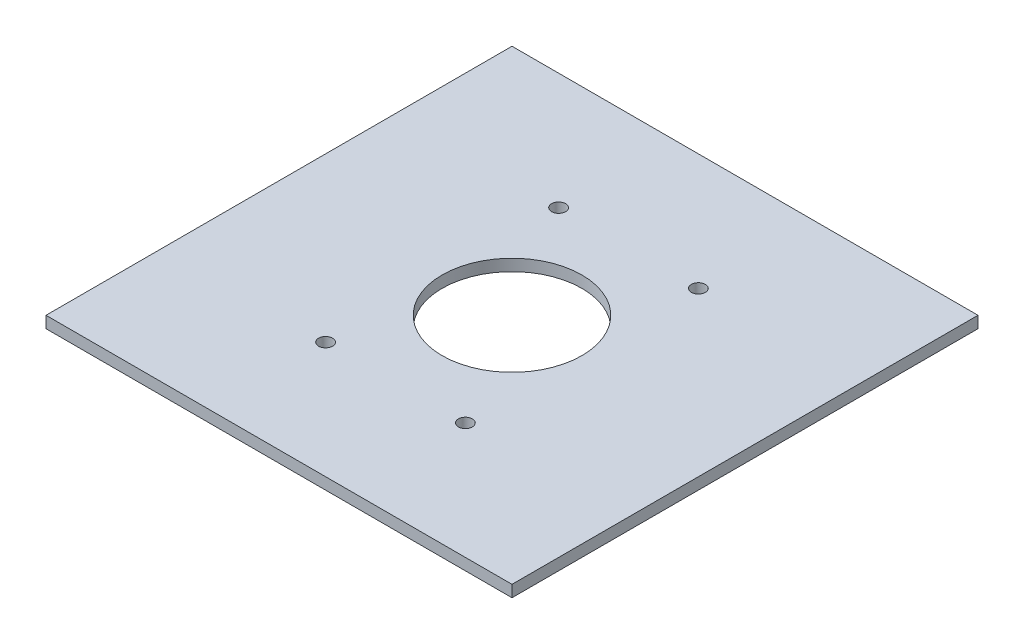
ISO-10303-21;
HEADER;
FILE_DESCRIPTION(('STEP AP214'),'2;1');
FILE_NAME('part.step','',(''),(''),'','','');
FILE_SCHEMA(('AUTOMOTIVE_DESIGN { 1 0 10303 214 1 1 1 1 }'));
ENDSEC;
DATA;
#1=APPLICATION_CONTEXT('core data for automotive mechanical design processes');
#2=APPLICATION_PROTOCOL_DEFINITION('international standard','automotive_design',2000,#1);
#3=PRODUCT_CONTEXT('',#1,'mechanical');
#4=PRODUCT('Part','Part','',(#3));
#5=PRODUCT_RELATED_PRODUCT_CATEGORY('part','',(#4));
#6=PRODUCT_DEFINITION_FORMATION('','',#4);
#7=PRODUCT_DEFINITION_CONTEXT('part definition',#1,'design');
#8=PRODUCT_DEFINITION('design','',#6,#7);
#9=PRODUCT_DEFINITION_SHAPE('','',#8);
#10=(LENGTH_UNIT() NAMED_UNIT(*) SI_UNIT(.MILLI.,.METRE.));
#11=(NAMED_UNIT(*) PLANE_ANGLE_UNIT() SI_UNIT($,.RADIAN.));
#12=(NAMED_UNIT(*) SI_UNIT($,.STERADIAN.) SOLID_ANGLE_UNIT());
#13=UNCERTAINTY_MEASURE_WITH_UNIT(LENGTH_MEASURE(1.E-05),#10,'distance_accuracy_value','');
#14=(GEOMETRIC_REPRESENTATION_CONTEXT(3) GLOBAL_UNCERTAINTY_ASSIGNED_CONTEXT((#13)) GLOBAL_UNIT_ASSIGNED_CONTEXT((#10,
#11,#12)) REPRESENTATION_CONTEXT('',''));
#15=CARTESIAN_POINT('',(0.,0.,0.));
#16=DIRECTION('',(0.,0.,1.));
#17=DIRECTION('',(1.,0.,0.));
#18=AXIS2_PLACEMENT_3D('',#15,#16,#17);
#19=CARTESIAN_POINT('',(63.5,3.175,63.5));
#20=DIRECTION('',(-1.,0.,0.));
#21=DIRECTION('',(0.,0.,1.));
#22=AXIS2_PLACEMENT_3D('',#19,#20,#21);
#23=PLANE('',#22);
#24=DIRECTION('',(0.,0.,-1.));
#25=VECTOR('',#24,1.);
#26=CARTESIAN_POINT('',(63.5,0.,63.5));
#27=LINE('',#26,#25);
#28=CARTESIAN_POINT('',(63.5,0.,63.5));
#29=VERTEX_POINT('',#28);
#30=CARTESIAN_POINT('',(63.5,0.,-63.5));
#31=VERTEX_POINT('',#30);
#32=EDGE_CURVE('E98',#29,#31,#27,.T.);
#33=ORIENTED_EDGE('',*,*,#32,.T.);
#34=DIRECTION('',(0.,-1.,0.));
#35=VECTOR('',#34,1.);
#36=CARTESIAN_POINT('',(63.5,3.175,-63.5));
#37=LINE('',#36,#35);
#38=CARTESIAN_POINT('',(63.5,3.175,-63.5));
#39=VERTEX_POINT('',#38);
#40=EDGE_CURVE('E11',#39,#31,#37,.T.);
#41=ORIENTED_EDGE('',*,*,#40,.F.);
#42=DIRECTION('',(0.,0.,-1.));
#43=VECTOR('',#42,1.);
#44=CARTESIAN_POINT('',(63.5,3.175,63.5));
#45=LINE('',#44,#43);
#46=CARTESIAN_POINT('',(63.5,3.175,63.5));
#47=VERTEX_POINT('',#46);
#48=EDGE_CURVE('E86',#47,#39,#45,.T.);
#49=ORIENTED_EDGE('',*,*,#48,.F.);
#50=DIRECTION('',(0.,-1.,0.));
#51=VECTOR('',#50,1.);
#52=CARTESIAN_POINT('',(63.5,3.175,63.5));
#53=LINE('',#52,#51);
#54=EDGE_CURVE('E94',#47,#29,#53,.T.);
#55=ORIENTED_EDGE('',*,*,#54,.T.);
#56=EDGE_LOOP('',(#33,#41,#49,#55));
#57=FACE_BOUND('',#56,.T.);
#58=ADVANCED_FACE('F35',(#57),#23,.F.);
#59=CARTESIAN_POINT('',(-63.5,3.175,-63.5));
#60=DIRECTION('',(0.,0.,1.));
#61=DIRECTION('',(1.,0.,0.));
#62=AXIS2_PLACEMENT_3D('',#59,#60,#61);
#63=PLANE('',#62);
#64=DIRECTION('',(-1.,0.,0.));
#65=VECTOR('',#64,1.);
#66=CARTESIAN_POINT('',(-63.5,0.,-63.5));
#67=LINE('',#66,#65);
#68=CARTESIAN_POINT('',(-63.5,0.,-63.5));
#69=VERTEX_POINT('',#68);
#70=EDGE_CURVE('E90',#31,#69,#67,.T.);
#71=ORIENTED_EDGE('',*,*,#70,.T.);
#72=DIRECTION('',(0.,-1.,0.));
#73=VECTOR('',#72,1.);
#74=CARTESIAN_POINT('',(-63.5,3.175,-63.5));
#75=LINE('',#74,#73);
#76=CARTESIAN_POINT('',(-63.5,3.175,-63.5));
#77=VERTEX_POINT('',#76);
#78=EDGE_CURVE('E43',#77,#69,#75,.T.);
#79=ORIENTED_EDGE('',*,*,#78,.F.);
#80=DIRECTION('',(-1.,0.,0.));
#81=VECTOR('',#80,1.);
#82=CARTESIAN_POINT('',(-63.5,3.175,-63.5));
#83=LINE('',#82,#81);
#84=EDGE_CURVE('E81',#39,#77,#83,.T.);
#85=ORIENTED_EDGE('',*,*,#84,.F.);
#86=ORIENTED_EDGE('',*,*,#40,.T.);
#87=EDGE_LOOP('',(#71,#79,#85,#86));
#88=FACE_BOUND('',#87,.T.);
#89=ADVANCED_FACE('F89',(#88),#63,.F.);
#90=CARTESIAN_POINT('',(-63.5,3.175,63.5));
#91=DIRECTION('',(1.,0.,0.));
#92=DIRECTION('',(0.,0.,-1.));
#93=AXIS2_PLACEMENT_3D('',#90,#91,#92);
#94=PLANE('',#93);
#95=DIRECTION('',(0.,0.,1.));
#96=VECTOR('',#95,1.);
#97=CARTESIAN_POINT('',(-63.5,0.,63.5));
#98=LINE('',#97,#96);
#99=CARTESIAN_POINT('',(-63.5,0.,63.5));
#100=VERTEX_POINT('',#99);
#101=EDGE_CURVE('E68',#69,#100,#98,.T.);
#102=ORIENTED_EDGE('',*,*,#101,.T.);
#103=DIRECTION('',(0.,-1.,0.));
#104=VECTOR('',#103,1.);
#105=CARTESIAN_POINT('',(-63.5,3.175,63.5));
#106=LINE('',#105,#104);
#107=CARTESIAN_POINT('',(-63.5,3.175,63.5));
#108=VERTEX_POINT('',#107);
#109=EDGE_CURVE('E91',#108,#100,#106,.T.);
#110=ORIENTED_EDGE('',*,*,#109,.F.);
#111=DIRECTION('',(0.,0.,1.));
#112=VECTOR('',#111,1.);
#113=CARTESIAN_POINT('',(-63.5,3.175,63.5));
#114=LINE('',#113,#112);
#115=EDGE_CURVE('E84',#77,#108,#114,.T.);
#116=ORIENTED_EDGE('',*,*,#115,.F.);
#117=ORIENTED_EDGE('',*,*,#78,.T.);
#118=EDGE_LOOP('',(#102,#110,#116,#117));
#119=FACE_BOUND('',#118,.T.);
#120=ADVANCED_FACE('F92',(#119),#94,.F.);
#121=CARTESIAN_POINT('',(-63.5,3.175,63.5));
#122=DIRECTION('',(0.,0.,-1.));
#123=DIRECTION('',(-1.,0.,0.));
#124=AXIS2_PLACEMENT_3D('',#121,#122,#123);
#125=PLANE('',#124);
#126=DIRECTION('',(1.,0.,0.));
#127=VECTOR('',#126,1.);
#128=CARTESIAN_POINT('',(-63.5,0.,63.5));
#129=LINE('',#128,#127);
#130=EDGE_CURVE('E74',#100,#29,#129,.T.);
#131=ORIENTED_EDGE('',*,*,#130,.T.);
#132=ORIENTED_EDGE('',*,*,#54,.F.);
#133=DIRECTION('',(1.,0.,0.));
#134=VECTOR('',#133,1.);
#135=CARTESIAN_POINT('',(-63.5,3.175,63.5));
#136=LINE('',#135,#134);
#137=EDGE_CURVE('E51',#108,#47,#136,.T.);
#138=ORIENTED_EDGE('',*,*,#137,.F.);
#139=ORIENTED_EDGE('',*,*,#109,.T.);
#140=EDGE_LOOP('',(#131,#132,#138,#139));
#141=FACE_BOUND('',#140,.T.);
#142=ADVANCED_FACE('F106',(#141),#125,.F.);
#143=CARTESIAN_POINT('',(0.,3.175,0.));
#144=DIRECTION('',(0.,-1.,0.));
#145=DIRECTION('',(0.,0.,-1.));
#146=AXIS2_PLACEMENT_3D('',#143,#144,#145);
#147=PLANE('',#146);
#148=CARTESIAN_POINT('',(19.05,3.175,31.75));
#149=DIRECTION('',(0.,1.,0.));
#150=DIRECTION('',(0.,0.,1.));
#151=AXIS2_PLACEMENT_3D('',#148,#149,#150);
#152=CIRCLE('',#151,1.905);
#153=CARTESIAN_POINT('',(19.05,3.175,33.655));
#154=VERTEX_POINT('',#153);
#155=EDGE_CURVE('E121',#154,#154,#152,.T.);
#156=ORIENTED_EDGE('',*,*,#155,.F.);
#157=EDGE_LOOP('',(#156));
#158=FACE_BOUND('',#157,.T.);
#159=CARTESIAN_POINT('',(-19.05,3.175,31.75));
#160=DIRECTION('',(0.,1.,0.));
#161=DIRECTION('',(0.,0.,1.));
#162=AXIS2_PLACEMENT_3D('',#159,#160,#161);
#163=CIRCLE('',#162,1.905);
#164=CARTESIAN_POINT('',(-19.05,3.175,33.655));
#165=VERTEX_POINT('',#164);
#166=EDGE_CURVE('E127',#165,#165,#163,.T.);
#167=ORIENTED_EDGE('',*,*,#166,.F.);
#168=EDGE_LOOP('',(#167));
#169=FACE_BOUND('',#168,.T.);
#170=CARTESIAN_POINT('',(19.05,3.175,-31.75));
#171=DIRECTION('',(0.,1.,0.));
#172=DIRECTION('',(0.,0.,1.));
#173=AXIS2_PLACEMENT_3D('',#170,#171,#172);
#174=CIRCLE('',#173,1.905);
#175=CARTESIAN_POINT('',(19.05,3.175,-29.845));
#176=VERTEX_POINT('',#175);
#177=EDGE_CURVE('E133',#176,#176,#174,.T.);
#178=ORIENTED_EDGE('',*,*,#177,.F.);
#179=EDGE_LOOP('',(#178));
#180=FACE_BOUND('',#179,.T.);
#181=CARTESIAN_POINT('',(-19.05,3.175,-31.75));
#182=DIRECTION('',(0.,1.,0.));
#183=DIRECTION('',(0.,0.,1.));
#184=AXIS2_PLACEMENT_3D('',#181,#182,#183);
#185=CIRCLE('',#184,1.905);
#186=CARTESIAN_POINT('',(-19.05,3.175,-29.845));
#187=VERTEX_POINT('',#186);
#188=EDGE_CURVE('E115',#187,#187,#185,.T.);
#189=ORIENTED_EDGE('',*,*,#188,.F.);
#190=EDGE_LOOP('',(#189));
#191=FACE_BOUND('',#190,.T.);
#192=CARTESIAN_POINT('',(0.,3.175,0.));
#193=DIRECTION('',(0.,1.,0.));
#194=DIRECTION('',(0.,0.,1.));
#195=AXIS2_PLACEMENT_3D('',#192,#193,#194);
#196=CIRCLE('',#195,19.05);
#197=CARTESIAN_POINT('',(0.,3.175,19.05));
#198=VERTEX_POINT('',#197);
#199=EDGE_CURVE('E101',#198,#198,#196,.T.);
#200=ORIENTED_EDGE('',*,*,#199,.F.);
#201=EDGE_LOOP('',(#200));
#202=FACE_BOUND('',#201,.T.);
#203=ORIENTED_EDGE('',*,*,#48,.T.);
#204=ORIENTED_EDGE('',*,*,#84,.T.);
#205=ORIENTED_EDGE('',*,*,#115,.T.);
#206=ORIENTED_EDGE('',*,*,#137,.T.);
#207=EDGE_LOOP('',(#203,#204,#205,#206));
#208=FACE_BOUND('',#207,.T.);
#209=ADVANCED_FACE('F82',(#158,#169,#180,#191,#202,#208),#147,.F.);
#210=CARTESIAN_POINT('',(0.,0.,0.));
#211=DIRECTION('',(0.,-1.,0.));
#212=DIRECTION('',(0.,0.,-1.));
#213=AXIS2_PLACEMENT_3D('',#210,#211,#212);
#214=PLANE('',#213);
#215=CARTESIAN_POINT('',(19.05,0.,31.75));
#216=DIRECTION('',(0.,1.,0.));
#217=DIRECTION('',(0.,0.,1.));
#218=AXIS2_PLACEMENT_3D('',#215,#216,#217);
#219=CIRCLE('',#218,1.905);
#220=CARTESIAN_POINT('',(19.05,0.,33.655));
#221=VERTEX_POINT('',#220);
#222=EDGE_CURVE('E118',#221,#221,#219,.T.);
#223=ORIENTED_EDGE('',*,*,#222,.T.);
#224=EDGE_LOOP('',(#223));
#225=FACE_BOUND('',#224,.T.);
#226=CARTESIAN_POINT('',(-19.05,0.,31.75));
#227=DIRECTION('',(0.,1.,0.));
#228=DIRECTION('',(0.,0.,1.));
#229=AXIS2_PLACEMENT_3D('',#226,#227,#228);
#230=CIRCLE('',#229,1.905);
#231=CARTESIAN_POINT('',(-19.05,0.,33.655));
#232=VERTEX_POINT('',#231);
#233=EDGE_CURVE('E124',#232,#232,#230,.T.);
#234=ORIENTED_EDGE('',*,*,#233,.T.);
#235=EDGE_LOOP('',(#234));
#236=FACE_BOUND('',#235,.T.);
#237=CARTESIAN_POINT('',(19.05,0.,-31.75));
#238=DIRECTION('',(0.,1.,0.));
#239=DIRECTION('',(0.,0.,1.));
#240=AXIS2_PLACEMENT_3D('',#237,#238,#239);
#241=CIRCLE('',#240,1.905);
#242=CARTESIAN_POINT('',(19.05,0.,-29.845));
#243=VERTEX_POINT('',#242);
#244=EDGE_CURVE('E130',#243,#243,#241,.T.);
#245=ORIENTED_EDGE('',*,*,#244,.T.);
#246=EDGE_LOOP('',(#245));
#247=FACE_BOUND('',#246,.T.);
#248=CARTESIAN_POINT('',(-19.05,0.,-31.75));
#249=DIRECTION('',(0.,1.,0.));
#250=DIRECTION('',(0.,0.,1.));
#251=AXIS2_PLACEMENT_3D('',#248,#249,#250);
#252=CIRCLE('',#251,1.905);
#253=CARTESIAN_POINT('',(-19.05,0.,-29.845));
#254=VERTEX_POINT('',#253);
#255=EDGE_CURVE('E136',#254,#254,#252,.T.);
#256=ORIENTED_EDGE('',*,*,#255,.T.);
#257=EDGE_LOOP('',(#256));
#258=FACE_BOUND('',#257,.T.);
#259=CARTESIAN_POINT('',(0.,0.,0.));
#260=DIRECTION('',(0.,1.,0.));
#261=DIRECTION('',(0.,0.,1.));
#262=AXIS2_PLACEMENT_3D('',#259,#260,#261);
#263=CIRCLE('',#262,19.05);
#264=CARTESIAN_POINT('',(0.,0.,19.05));
#265=VERTEX_POINT('',#264);
#266=EDGE_CURVE('E112',#265,#265,#263,.T.);
#267=ORIENTED_EDGE('',*,*,#266,.T.);
#268=EDGE_LOOP('',(#267));
#269=FACE_BOUND('',#268,.T.);
#270=ORIENTED_EDGE('',*,*,#32,.F.);
#271=ORIENTED_EDGE('',*,*,#130,.F.);
#272=ORIENTED_EDGE('',*,*,#101,.F.);
#273=ORIENTED_EDGE('',*,*,#70,.F.);
#274=EDGE_LOOP('',(#270,#271,#272,#273));
#275=FACE_BOUND('',#274,.T.);
#276=ADVANCED_FACE('F109',(#225,#236,#247,#258,#269,#275),#214,.T.);
#277=CARTESIAN_POINT('',(0.,3.175,0.));
#278=DIRECTION('',(0.,-1.,0.));
#279=DIRECTION('',(0.,0.,-1.));
#280=AXIS2_PLACEMENT_3D('',#277,#278,#279);
#281=CYLINDRICAL_SURFACE('',#280,19.05);
#282=ORIENTED_EDGE('',*,*,#199,.T.);
#283=EDGE_LOOP('',(#282));
#284=FACE_BOUND('',#283,.T.);
#285=ORIENTED_EDGE('',*,*,#266,.F.);
#286=EDGE_LOOP('',(#285));
#287=FACE_BOUND('',#286,.T.);
#288=ADVANCED_FACE('F151',(#284,#287),#281,.F.);
#289=CARTESIAN_POINT('',(-19.05,3.175,-31.75));
#290=DIRECTION('',(0.,-1.,0.));
#291=DIRECTION('',(0.,0.,-1.));
#292=AXIS2_PLACEMENT_3D('',#289,#290,#291);
#293=CYLINDRICAL_SURFACE('',#292,1.905);
#294=ORIENTED_EDGE('',*,*,#188,.T.);
#295=EDGE_LOOP('',(#294));
#296=FACE_BOUND('',#295,.T.);
#297=ORIENTED_EDGE('',*,*,#255,.F.);
#298=EDGE_LOOP('',(#297));
#299=FACE_BOUND('',#298,.T.);
#300=ADVANCED_FACE('F142',(#296,#299),#293,.F.);
#301=CARTESIAN_POINT('',(19.05,3.175,-31.75));
#302=DIRECTION('',(0.,-1.,0.));
#303=DIRECTION('',(0.,0.,-1.));
#304=AXIS2_PLACEMENT_3D('',#301,#302,#303);
#305=CYLINDRICAL_SURFACE('',#304,1.905);
#306=ORIENTED_EDGE('',*,*,#177,.T.);
#307=EDGE_LOOP('',(#306));
#308=FACE_BOUND('',#307,.T.);
#309=ORIENTED_EDGE('',*,*,#244,.F.);
#310=EDGE_LOOP('',(#309));
#311=FACE_BOUND('',#310,.T.);
#312=ADVANCED_FACE('F200',(#308,#311),#305,.F.);
#313=CARTESIAN_POINT('',(-19.05,3.175,31.75));
#314=DIRECTION('',(0.,-1.,0.));
#315=DIRECTION('',(0.,0.,-1.));
#316=AXIS2_PLACEMENT_3D('',#313,#314,#315);
#317=CYLINDRICAL_SURFACE('',#316,1.905);
#318=ORIENTED_EDGE('',*,*,#166,.T.);
#319=EDGE_LOOP('',(#318));
#320=FACE_BOUND('',#319,.T.);
#321=ORIENTED_EDGE('',*,*,#233,.F.);
#322=EDGE_LOOP('',(#321));
#323=FACE_BOUND('',#322,.T.);
#324=ADVANCED_FACE('F209',(#320,#323),#317,.F.);
#325=CARTESIAN_POINT('',(19.05,3.175,31.75));
#326=DIRECTION('',(0.,-1.,0.));
#327=DIRECTION('',(0.,0.,-1.));
#328=AXIS2_PLACEMENT_3D('',#325,#326,#327);
#329=CYLINDRICAL_SURFACE('',#328,1.905);
#330=ORIENTED_EDGE('',*,*,#155,.T.);
#331=EDGE_LOOP('',(#330));
#332=FACE_BOUND('',#331,.T.);
#333=ORIENTED_EDGE('',*,*,#222,.F.);
#334=EDGE_LOOP('',(#333));
#335=FACE_BOUND('',#334,.T.);
#336=ADVANCED_FACE('F219',(#332,#335),#329,.F.);
#337=CLOSED_SHELL('',(#58,#89,#120,#142,#209,#276,#288,#300,#312,#324,#336));
#338=MANIFOLD_SOLID_BREP('B2',#337);
#339=ADVANCED_BREP_SHAPE_REPRESENTATION('',(#18,#338),#14);
#340=SHAPE_DEFINITION_REPRESENTATION(#9,#339);
ENDSEC;
END-ISO-10303-21;
